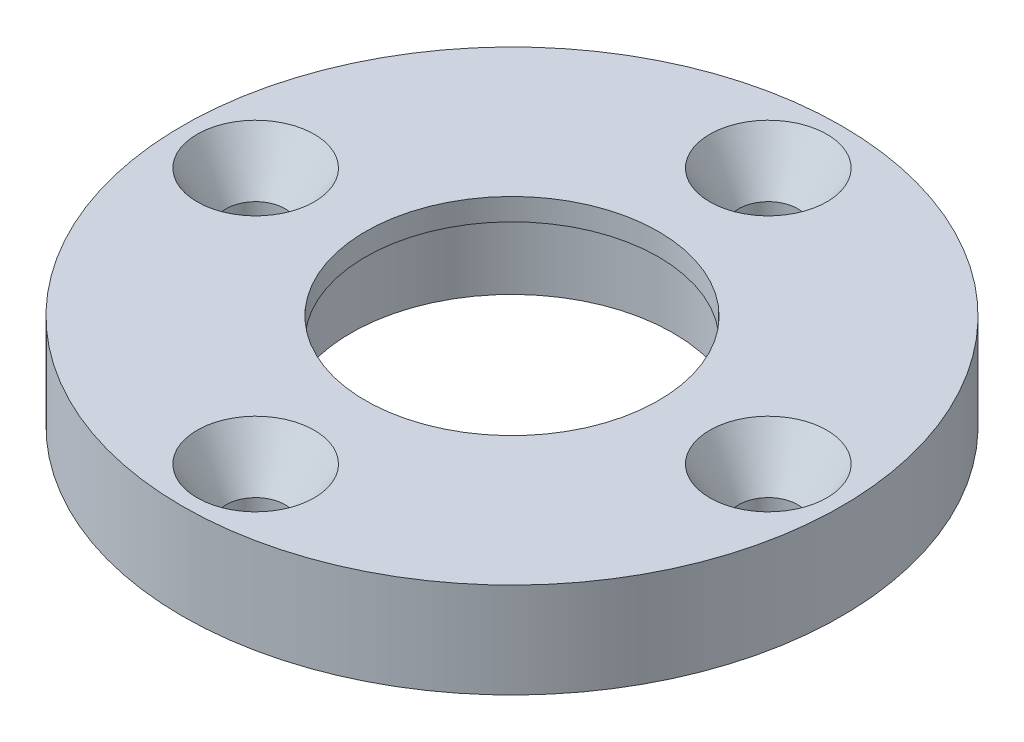
ISO-10303-21;
HEADER;
FILE_DESCRIPTION(('STEP AP214'),'2;1');
FILE_NAME('part.step','',(''),(''),'','','');
FILE_SCHEMA(('AUTOMOTIVE_DESIGN { 1 0 10303 214 1 1 1 1 }'));
ENDSEC;
DATA;
#1=APPLICATION_CONTEXT('core data for automotive mechanical design processes');
#2=APPLICATION_PROTOCOL_DEFINITION('international standard','automotive_design',2000,#1);
#3=PRODUCT_CONTEXT('',#1,'mechanical');
#4=PRODUCT('Part','Part','',(#3));
#5=PRODUCT_RELATED_PRODUCT_CATEGORY('part','',(#4));
#6=PRODUCT_DEFINITION_FORMATION('','',#4);
#7=PRODUCT_DEFINITION_CONTEXT('part definition',#1,'design');
#8=PRODUCT_DEFINITION('design','',#6,#7);
#9=PRODUCT_DEFINITION_SHAPE('','',#8);
#10=(LENGTH_UNIT() NAMED_UNIT(*) SI_UNIT(.MILLI.,.METRE.));
#11=(NAMED_UNIT(*) PLANE_ANGLE_UNIT() SI_UNIT($,.RADIAN.));
#12=(NAMED_UNIT(*) SI_UNIT($,.STERADIAN.) SOLID_ANGLE_UNIT());
#13=UNCERTAINTY_MEASURE_WITH_UNIT(LENGTH_MEASURE(1.E-05),#10,'distance_accuracy_value','');
#14=(GEOMETRIC_REPRESENTATION_CONTEXT(3) GLOBAL_UNCERTAINTY_ASSIGNED_CONTEXT((#13)) GLOBAL_UNIT_ASSIGNED_CONTEXT((#10,
#11,#12)) REPRESENTATION_CONTEXT('',''));
#15=CARTESIAN_POINT('',(0.,0.,0.));
#16=DIRECTION('',(0.,0.,1.));
#17=DIRECTION('',(1.,0.,0.));
#18=AXIS2_PLACEMENT_3D('',#15,#16,#17);
#19=CARTESIAN_POINT('',(0.,6.5,0.));
#20=DIRECTION('',(0.,-1.,0.));
#21=DIRECTION('',(0.,0.,-1.));
#22=AXIS2_PLACEMENT_3D('',#19,#20,#21);
#23=CYLINDRICAL_SURFACE('',#22,10.);
#24=CARTESIAN_POINT('',(0.,6.5,0.));
#25=DIRECTION('',(0.,1.,0.));
#26=DIRECTION('',(0.,0.,1.));
#27=AXIS2_PLACEMENT_3D('',#24,#25,#26);
#28=CIRCLE('',#27,10.);
#29=CARTESIAN_POINT('',(0.,6.5,-10.));
#30=VERTEX_POINT('',#29);
#31=EDGE_CURVE('E78',#30,#30,#28,.T.);
#32=CARTESIAN_POINT('',(0.,5.,0.));
#33=DIRECTION('',(0.,-1.,0.));
#34=DIRECTION('',(0.,0.,-1.));
#35=AXIS2_PLACEMENT_3D('',#32,#33,#34);
#36=CIRCLE('',#35,10.);
#37=CARTESIAN_POINT('',(0.,5.,-10.));
#38=VERTEX_POINT('',#37);
#39=EDGE_CURVE('E70',#38,#38,#36,.T.);
#40=CARTESIAN_POINT('',(0.,6.5,-10.));
#41=CARTESIAN_POINT('',(0.,6.484375,-10.));
#42=CARTESIAN_POINT('',(0.,6.46875,-10.));
#43=CARTESIAN_POINT('',(0.,6.4375,-10.));
#44=CARTESIAN_POINT('',(0.,6.421875,-10.));
#45=CARTESIAN_POINT('',(0.,6.390625,-10.));
#46=CARTESIAN_POINT('',(0.,6.375,-10.));
#47=CARTESIAN_POINT('',(0.,6.34375,-10.));
#48=CARTESIAN_POINT('',(0.,6.328125,-10.));
#49=CARTESIAN_POINT('',(0.,6.296875,-10.));
#50=CARTESIAN_POINT('',(0.,6.28125,-10.));
#51=CARTESIAN_POINT('',(0.,6.25,-10.));
#52=CARTESIAN_POINT('',(0.,6.234375,-10.));
#53=CARTESIAN_POINT('',(0.,6.203125,-10.));
#54=CARTESIAN_POINT('',(0.,6.1875,-10.));
#55=CARTESIAN_POINT('',(0.,6.15625,-10.));
#56=CARTESIAN_POINT('',(0.,6.140625,-10.));
#57=CARTESIAN_POINT('',(0.,6.109375,-10.));
#58=CARTESIAN_POINT('',(0.,6.09375,-10.));
#59=CARTESIAN_POINT('',(0.,6.0625,-10.));
#60=CARTESIAN_POINT('',(0.,6.046875,-10.));
#61=CARTESIAN_POINT('',(0.,6.015625,-10.));
#62=CARTESIAN_POINT('',(0.,6.,-10.));
#63=CARTESIAN_POINT('',(0.,5.96875,-10.));
#64=CARTESIAN_POINT('',(0.,5.953125,-10.));
#65=CARTESIAN_POINT('',(0.,5.921875,-10.));
#66=CARTESIAN_POINT('',(0.,5.90625,-10.));
#67=CARTESIAN_POINT('',(0.,5.875,-10.));
#68=CARTESIAN_POINT('',(0.,5.859375,-10.));
#69=CARTESIAN_POINT('',(0.,5.828125,-10.));
#70=CARTESIAN_POINT('',(0.,5.8125,-10.));
#71=CARTESIAN_POINT('',(0.,5.78125,-10.));
#72=CARTESIAN_POINT('',(0.,5.765625,-10.));
#73=CARTESIAN_POINT('',(0.,5.734375,-10.));
#74=CARTESIAN_POINT('',(0.,5.71875,-10.));
#75=CARTESIAN_POINT('',(0.,5.6875,-10.));
#76=CARTESIAN_POINT('',(0.,5.671875,-10.));
#77=CARTESIAN_POINT('',(0.,5.640625,-10.));
#78=CARTESIAN_POINT('',(0.,5.625,-10.));
#79=CARTESIAN_POINT('',(0.,5.59375,-10.));
#80=CARTESIAN_POINT('',(0.,5.578125,-10.));
#81=CARTESIAN_POINT('',(0.,5.546875,-10.));
#82=CARTESIAN_POINT('',(0.,5.53125,-10.));
#83=CARTESIAN_POINT('',(0.,5.5,-10.));
#84=CARTESIAN_POINT('',(0.,5.484375,-10.));
#85=CARTESIAN_POINT('',(0.,5.453125,-10.));
#86=CARTESIAN_POINT('',(0.,5.4375,-10.));
#87=CARTESIAN_POINT('',(0.,5.40625,-10.));
#88=CARTESIAN_POINT('',(0.,5.390625,-10.));
#89=CARTESIAN_POINT('',(0.,5.359375,-10.));
#90=CARTESIAN_POINT('',(0.,5.34375,-10.));
#91=CARTESIAN_POINT('',(0.,5.3125,-10.));
#92=CARTESIAN_POINT('',(0.,5.296875,-10.));
#93=CARTESIAN_POINT('',(0.,5.265625,-10.));
#94=CARTESIAN_POINT('',(0.,5.25,-10.));
#95=CARTESIAN_POINT('',(0.,5.21875,-10.));
#96=CARTESIAN_POINT('',(0.,5.203125,-10.));
#97=CARTESIAN_POINT('',(0.,5.171875,-10.));
#98=CARTESIAN_POINT('',(0.,5.15625,-10.));
#99=CARTESIAN_POINT('',(0.,5.125,-10.));
#100=CARTESIAN_POINT('',(0.,5.109375,-10.));
#101=CARTESIAN_POINT('',(0.,5.078125,-10.));
#102=CARTESIAN_POINT('',(0.,5.0625,-10.));
#103=CARTESIAN_POINT('',(0.,5.03125,-10.));
#104=CARTESIAN_POINT('',(0.,5.015625,-10.));
#105=CARTESIAN_POINT('',(0.,5.,-10.));
#106=B_SPLINE_CURVE_WITH_KNOTS('',3,(#40,#41,#42,#43,#44,#45,#46,#47,#48,#49,#50,#51,#52,#53,
#54,#55,#56,#57,#58,#59,#60,#61,#62,#63,#64,#65,#66,#67,#68,#69,#70,#71,#72,#73,#74,#75,#76,#77,
#78,#79,#80,#81,#82,#83,#84,#85,#86,#87,#88,#89,#90,#91,#92,#93,#94,#95,#96,#97,#98,#99,#100,
#101,#102,#103,#104,#105),.UNSPECIFIED.,.F.,.F.,(4,2,2,2,2,2,2,2,2,2,2,2,2,2,2,2,2,2,2,2,2,2,2,
2,2,2,2,2,2,2,2,2,4),(0.,0.046875,0.0937500000000001,0.140625,0.1875,0.234375,0.28125,0.328125,
0.375,0.421875,0.46875,0.515625,0.5625,0.609375,0.65625,0.703125,0.75,0.796875,0.84375,0.890625,
0.9375,0.984375,1.03125,1.078125,1.125,1.171875,1.21875,1.265625,1.3125,1.359375,1.40625,
1.453125,1.5),.UNSPECIFIED.);
#107=EDGE_CURVE('BSEAM37',#30,#38,#106,.T.);
#108=ORIENTED_EDGE('',*,*,#31,.T.);
#109=ORIENTED_EDGE('',*,*,#39,.T.);
#110=ORIENTED_EDGE('',*,*,#107,.T.);
#111=ORIENTED_EDGE('',*,*,#107,.F.);
#112=EDGE_LOOP('',(#108,#110,#109,#111));
#113=FACE_BOUND('',#112,.T.);
#114=ADVANCED_FACE('F37',(#113),#23,.F.);
#115=CARTESIAN_POINT('',(0.,6.5,0.));
#116=DIRECTION('',(0.,1.,0.));
#117=DIRECTION('',(0.,0.,1.));
#118=AXIS2_PLACEMENT_3D('',#115,#116,#117);
#119=PLANE('',#118);
#120=CARTESIAN_POINT('',(0.,6.5,17.5));
#121=DIRECTION('',(0.,1.,0.));
#122=DIRECTION('',(0.,0.,1.));
#123=AXIS2_PLACEMENT_3D('',#120,#121,#122);
#124=CIRCLE('',#123,4.00000000000004);
#125=CARTESIAN_POINT('',(0.,6.5,21.5));
#126=VERTEX_POINT('',#125);
#127=EDGE_CURVE('E52',#126,#126,#124,.F.);
#128=ORIENTED_EDGE('',*,*,#127,.T.);
#129=EDGE_LOOP('',(#128));
#130=FACE_BOUND('',#129,.T.);
#131=CARTESIAN_POINT('',(17.5,6.5,0.));
#132=DIRECTION('',(0.,1.,0.));
#133=DIRECTION('',(0.,0.,1.));
#134=AXIS2_PLACEMENT_3D('',#131,#132,#133);
#135=CIRCLE('',#134,4.00000000000006);
#136=CARTESIAN_POINT('',(17.5,6.5,4.00000000000012));
#137=VERTEX_POINT('',#136);
#138=EDGE_CURVE('E57',#137,#137,#135,.F.);
#139=ORIENTED_EDGE('',*,*,#138,.T.);
#140=EDGE_LOOP('',(#139));
#141=FACE_BOUND('',#140,.T.);
#142=CARTESIAN_POINT('',(0.,6.5,-17.5));
#143=DIRECTION('',(0.,1.,0.));
#144=DIRECTION('',(0.,0.,1.));
#145=AXIS2_PLACEMENT_3D('',#142,#143,#144);
#146=CIRCLE('',#145,4.00000000000002);
#147=CARTESIAN_POINT('',(0.,6.5,-13.5));
#148=VERTEX_POINT('',#147);
#149=EDGE_CURVE('E60',#148,#148,#146,.F.);
#150=ORIENTED_EDGE('',*,*,#149,.T.);
#151=EDGE_LOOP('',(#150));
#152=FACE_BOUND('',#151,.T.);
#153=CARTESIAN_POINT('',(-17.4999999999998,6.5,2.48689957516035E-13));
#154=DIRECTION('',(0.,1.,0.));
#155=DIRECTION('',(0.,0.,1.));
#156=AXIS2_PLACEMENT_3D('',#153,#154,#155);
#157=CIRCLE('',#156,4.00000000000004);
#158=CARTESIAN_POINT('',(-17.4999999999998,6.5,4.00000000000029));
#159=VERTEX_POINT('',#158);
#160=EDGE_CURVE('E63',#159,#159,#157,.F.);
#161=ORIENTED_EDGE('',*,*,#160,.T.);
#162=EDGE_LOOP('',(#161));
#163=FACE_BOUND('',#162,.T.);
#164=CARTESIAN_POINT('',(0.,6.5,0.));
#165=DIRECTION('',(0.,1.,0.));
#166=DIRECTION('',(0.,0.,1.));
#167=AXIS2_PLACEMENT_3D('',#164,#165,#166);
#168=CIRCLE('',#167,22.5);
#169=CARTESIAN_POINT('',(0.,6.5,-22.5));
#170=VERTEX_POINT('',#169);
#171=EDGE_CURVE('E69',#170,#170,#168,.T.);
#172=ORIENTED_EDGE('',*,*,#171,.T.);
#173=EDGE_LOOP('',(#172));
#174=FACE_BOUND('',#173,.T.);
#175=ORIENTED_EDGE('',*,*,#31,.F.);
#176=EDGE_LOOP('',(#175));
#177=FACE_BOUND('',#176,.T.);
#178=ADVANCED_FACE('F113',(#130,#141,#152,#163,#174,#177),#119,.T.);
#179=CARTESIAN_POINT('',(0.,0.,0.));
#180=DIRECTION('',(0.,1.,0.));
#181=DIRECTION('',(0.,0.,1.));
#182=AXIS2_PLACEMENT_3D('',#179,#180,#181);
#183=PLANE('',#182);
#184=CARTESIAN_POINT('',(0.,0.,0.));
#185=DIRECTION('',(0.,-1.,0.));
#186=DIRECTION('',(0.,0.,-1.));
#187=AXIS2_PLACEMENT_3D('',#184,#185,#186);
#188=CIRCLE('',#187,11.);
#189=CARTESIAN_POINT('',(0.,0.,-11.));
#190=VERTEX_POINT('',#189);
#191=EDGE_CURVE('E94',#190,#190,#188,.T.);
#192=ORIENTED_EDGE('',*,*,#191,.F.);
#193=EDGE_LOOP('',(#192));
#194=FACE_BOUND('',#193,.T.);
#195=CARTESIAN_POINT('',(0.,0.,-17.5));
#196=DIRECTION('',(0.,1.,0.));
#197=DIRECTION('',(0.,0.,1.));
#198=AXIS2_PLACEMENT_3D('',#195,#196,#197);
#199=CIRCLE('',#198,2.);
#200=CARTESIAN_POINT('',(0.,0.,-15.5));
#201=VERTEX_POINT('',#200);
#202=EDGE_CURVE('E83',#201,#201,#199,.T.);
#203=ORIENTED_EDGE('',*,*,#202,.T.);
#204=EDGE_LOOP('',(#203));
#205=FACE_BOUND('',#204,.T.);
#206=CARTESIAN_POINT('',(17.5,0.,0.));
#207=DIRECTION('',(0.,1.,0.));
#208=DIRECTION('',(0.,0.,1.));
#209=AXIS2_PLACEMENT_3D('',#206,#207,#208);
#210=CIRCLE('',#209,2.);
#211=CARTESIAN_POINT('',(17.5,0.,2.00000000000006));
#212=VERTEX_POINT('',#211);
#213=EDGE_CURVE('E89',#212,#212,#210,.T.);
#214=ORIENTED_EDGE('',*,*,#213,.T.);
#215=EDGE_LOOP('',(#214));
#216=FACE_BOUND('',#215,.T.);
#217=CARTESIAN_POINT('',(0.,0.,17.5));
#218=DIRECTION('',(0.,1.,0.));
#219=DIRECTION('',(0.,0.,1.));
#220=AXIS2_PLACEMENT_3D('',#217,#218,#219);
#221=CIRCLE('',#220,2.);
#222=CARTESIAN_POINT('',(0.,0.,19.5));
#223=VERTEX_POINT('',#222);
#224=EDGE_CURVE('E86',#223,#223,#221,.T.);
#225=ORIENTED_EDGE('',*,*,#224,.T.);
#226=EDGE_LOOP('',(#225));
#227=FACE_BOUND('',#226,.T.);
#228=CARTESIAN_POINT('',(-17.4999999999998,0.,2.48689957516035E-13));
#229=DIRECTION('',(0.,1.,0.));
#230=DIRECTION('',(0.,0.,1.));
#231=AXIS2_PLACEMENT_3D('',#228,#229,#230);
#232=CIRCLE('',#231,2.);
#233=CARTESIAN_POINT('',(-17.4999999999998,0.,2.00000000000025));
#234=VERTEX_POINT('',#233);
#235=EDGE_CURVE('E73',#234,#234,#232,.T.);
#236=ORIENTED_EDGE('',*,*,#235,.T.);
#237=EDGE_LOOP('',(#236));
#238=FACE_BOUND('',#237,.T.);
#239=CARTESIAN_POINT('',(0.,0.,0.));
#240=DIRECTION('',(0.,1.,0.));
#241=DIRECTION('',(0.,0.,1.));
#242=AXIS2_PLACEMENT_3D('',#239,#240,#241);
#243=CIRCLE('',#242,22.5);
#244=CARTESIAN_POINT('',(0.,0.,-22.5));
#245=VERTEX_POINT('',#244);
#246=EDGE_CURVE('E75',#245,#245,#243,.T.);
#247=ORIENTED_EDGE('',*,*,#246,.F.);
#248=EDGE_LOOP('',(#247));
#249=FACE_BOUND('',#248,.T.);
#250=ADVANCED_FACE('F109',(#194,#205,#216,#227,#238,#249),#183,.F.);
#251=CARTESIAN_POINT('',(0.,6.5,0.));
#252=DIRECTION('',(0.,-1.,0.));
#253=DIRECTION('',(0.,0.,-1.));
#254=AXIS2_PLACEMENT_3D('',#251,#252,#253);
#255=CYLINDRICAL_SURFACE('',#254,22.5);
#256=CARTESIAN_POINT('',(0.,6.5,-22.5));
#257=CARTESIAN_POINT('',(0.,6.43229166666667,-22.5));
#258=CARTESIAN_POINT('',(0.,6.36458333333333,-22.5));
#259=CARTESIAN_POINT('',(0.,6.22916666666667,-22.5));
#260=CARTESIAN_POINT('',(0.,6.16145833333333,-22.5));
#261=CARTESIAN_POINT('',(0.,6.02604166666667,-22.5));
#262=CARTESIAN_POINT('',(0.,5.95833333333333,-22.5));
#263=CARTESIAN_POINT('',(0.,5.82291666666667,-22.5));
#264=CARTESIAN_POINT('',(0.,5.75520833333333,-22.5));
#265=CARTESIAN_POINT('',(0.,5.61979166666667,-22.5));
#266=CARTESIAN_POINT('',(0.,5.55208333333333,-22.5));
#267=CARTESIAN_POINT('',(0.,5.41666666666667,-22.5));
#268=CARTESIAN_POINT('',(0.,5.34895833333333,-22.5));
#269=CARTESIAN_POINT('',(0.,5.21354166666667,-22.5));
#270=CARTESIAN_POINT('',(0.,5.14583333333333,-22.5));
#271=CARTESIAN_POINT('',(0.,5.01041666666667,-22.5));
#272=CARTESIAN_POINT('',(0.,4.94270833333333,-22.5));
#273=CARTESIAN_POINT('',(0.,4.80729166666667,-22.5));
#274=CARTESIAN_POINT('',(0.,4.73958333333333,-22.5));
#275=CARTESIAN_POINT('',(0.,4.60416666666667,-22.5));
#276=CARTESIAN_POINT('',(0.,4.53645833333333,-22.5));
#277=CARTESIAN_POINT('',(0.,4.40104166666667,-22.5));
#278=CARTESIAN_POINT('',(0.,4.33333333333333,-22.5));
#279=CARTESIAN_POINT('',(0.,4.19791666666667,-22.5));
#280=CARTESIAN_POINT('',(0.,4.13020833333333,-22.5));
#281=CARTESIAN_POINT('',(0.,3.99479166666667,-22.5));
#282=CARTESIAN_POINT('',(0.,3.92708333333333,-22.5));
#283=CARTESIAN_POINT('',(0.,3.79166666666667,-22.5));
#284=CARTESIAN_POINT('',(0.,3.72395833333333,-22.5));
#285=CARTESIAN_POINT('',(0.,3.58854166666667,-22.5));
#286=CARTESIAN_POINT('',(0.,3.52083333333333,-22.5));
#287=CARTESIAN_POINT('',(0.,3.38541666666667,-22.5));
#288=CARTESIAN_POINT('',(0.,3.31770833333333,-22.5));
#289=CARTESIAN_POINT('',(0.,3.18229166666667,-22.5));
#290=CARTESIAN_POINT('',(0.,3.11458333333333,-22.5));
#291=CARTESIAN_POINT('',(0.,2.97916666666667,-22.5));
#292=CARTESIAN_POINT('',(0.,2.91145833333333,-22.5));
#293=CARTESIAN_POINT('',(0.,2.77604166666667,-22.5));
#294=CARTESIAN_POINT('',(0.,2.70833333333333,-22.5));
#295=CARTESIAN_POINT('',(0.,2.57291666666667,-22.5));
#296=CARTESIAN_POINT('',(0.,2.50520833333333,-22.5));
#297=CARTESIAN_POINT('',(0.,2.36979166666667,-22.5));
#298=CARTESIAN_POINT('',(0.,2.30208333333333,-22.5));
#299=CARTESIAN_POINT('',(0.,2.16666666666667,-22.5));
#300=CARTESIAN_POINT('',(0.,2.09895833333333,-22.5));
#301=CARTESIAN_POINT('',(0.,1.96354166666667,-22.5));
#302=CARTESIAN_POINT('',(0.,1.89583333333333,-22.5));
#303=CARTESIAN_POINT('',(0.,1.76041666666667,-22.5));
#304=CARTESIAN_POINT('',(0.,1.69270833333333,-22.5));
#305=CARTESIAN_POINT('',(0.,1.55729166666667,-22.5));
#306=CARTESIAN_POINT('',(0.,1.48958333333333,-22.5));
#307=CARTESIAN_POINT('',(0.,1.35416666666667,-22.5));
#308=CARTESIAN_POINT('',(0.,1.28645833333333,-22.5));
#309=CARTESIAN_POINT('',(0.,1.15104166666667,-22.5));
#310=CARTESIAN_POINT('',(0.,1.08333333333333,-22.5));
#311=CARTESIAN_POINT('',(0.,0.947916666666667,-22.5));
#312=CARTESIAN_POINT('',(0.,0.880208333333333,-22.5));
#313=CARTESIAN_POINT('',(0.,0.744791666666667,-22.5));
#314=CARTESIAN_POINT('',(0.,0.677083333333333,-22.5));
#315=CARTESIAN_POINT('',(0.,0.541666666666667,-22.5));
#316=CARTESIAN_POINT('',(0.,0.473958333333333,-22.5));
#317=CARTESIAN_POINT('',(0.,0.338541666666667,-22.5));
#318=CARTESIAN_POINT('',(0.,0.270833333333334,-22.5));
#319=CARTESIAN_POINT('',(0.,0.135416666666667,-22.5));
#320=CARTESIAN_POINT('',(0.,0.0677083333333334,-22.5));
#321=CARTESIAN_POINT('',(0.,0.,-22.5));
#322=B_SPLINE_CURVE_WITH_KNOTS('',3,(#256,#257,#258,#259,#260,#261,#262,#263,#264,#265,#266,
#267,#268,#269,#270,#271,#272,#273,#274,#275,#276,#277,#278,#279,#280,#281,#282,#283,#284,#285,
#286,#287,#288,#289,#290,#291,#292,#293,#294,#295,#296,#297,#298,#299,#300,#301,#302,#303,#304,
#305,#306,#307,#308,#309,#310,#311,#312,#313,#314,#315,#316,#317,#318,#319,#320,#321),
.UNSPECIFIED.,.F.,.F.,(4,2,2,2,2,2,2,2,2,2,2,2,2,2,2,2,2,2,2,2,2,2,2,2,2,2,2,2,2,2,2,2,4),(0.,
0.203125,0.40625,0.609375000000001,0.812500000000001,1.015625,1.21875,1.421875,1.625,1.828125,
2.03125,2.234375,2.4375,2.640625,2.84375,3.046875,3.25,3.453125,3.65625,3.859375,4.0625,
4.265625,4.46875,4.671875,4.875,5.078125,5.28125,5.484375,5.6875,5.890625,6.09375,6.296875,6.5),.UNSPECIFIED.);
#323=EDGE_CURVE('BSEAM112',#170,#245,#322,.T.);
#324=ORIENTED_EDGE('',*,*,#171,.F.);
#325=ORIENTED_EDGE('',*,*,#246,.T.);
#326=ORIENTED_EDGE('',*,*,#323,.T.);
#327=ORIENTED_EDGE('',*,*,#323,.F.);
#328=EDGE_LOOP('',(#324,#326,#325,#327));
#329=FACE_BOUND('',#328,.T.);
#330=ADVANCED_FACE('F112',(#329),#255,.T.);
#331=CARTESIAN_POINT('',(-17.4999999999998,0.,2.48689957516035E-13));
#332=DIRECTION('',(0.,1.,0.));
#333=DIRECTION('',(0.,0.,1.));
#334=AXIS2_PLACEMENT_3D('',#331,#332,#333);
#335=CYLINDRICAL_SURFACE('',#334,2.);
#336=CARTESIAN_POINT('',(-17.4999999999998,3.09999999999991,2.48689957516035E-13));
#337=DIRECTION('',(0.,1.,0.));
#338=DIRECTION('',(0.,0.,1.));
#339=AXIS2_PLACEMENT_3D('',#336,#337,#338);
#340=CIRCLE('',#339,2.);
#341=CARTESIAN_POINT('',(-17.4999999999998,3.09999999999991,2.00000000000025));
#342=VERTEX_POINT('',#341);
#343=EDGE_CURVE('E10',#342,#342,#340,.T.);
#344=CARTESIAN_POINT('',(-17.4999999999998,3.09999999999991,2.00000000000025));
#345=CARTESIAN_POINT('',(-17.4999999999998,3.06770833333324,2.00000000000025));
#346=CARTESIAN_POINT('',(-17.4999999999998,3.03541666666658,2.00000000000025));
#347=CARTESIAN_POINT('',(-17.4999999999998,2.97083333333324,2.00000000000025));
#348=CARTESIAN_POINT('',(-17.4999999999998,2.93854166666658,2.00000000000025));
#349=CARTESIAN_POINT('',(-17.4999999999998,2.87395833333325,2.00000000000025));
#350=CARTESIAN_POINT('',(-17.4999999999998,2.84166666666658,2.00000000000025));
#351=CARTESIAN_POINT('',(-17.4999999999998,2.77708333333325,2.00000000000025));
#352=CARTESIAN_POINT('',(-17.4999999999998,2.74479166666658,2.00000000000025));
#353=CARTESIAN_POINT('',(-17.4999999999998,2.68020833333325,2.00000000000025));
#354=CARTESIAN_POINT('',(-17.4999999999998,2.64791666666659,2.00000000000025));
#355=CARTESIAN_POINT('',(-17.4999999999998,2.58333333333326,2.00000000000025));
#356=CARTESIAN_POINT('',(-17.4999999999998,2.55104166666659,2.00000000000025));
#357=CARTESIAN_POINT('',(-17.4999999999998,2.48645833333326,2.00000000000025));
#358=CARTESIAN_POINT('',(-17.4999999999998,2.45416666666659,2.00000000000025));
#359=CARTESIAN_POINT('',(-17.4999999999998,2.38958333333326,2.00000000000025));
#360=CARTESIAN_POINT('',(-17.4999999999998,2.3572916666666,2.00000000000025));
#361=CARTESIAN_POINT('',(-17.4999999999998,2.29270833333326,2.00000000000025));
#362=CARTESIAN_POINT('',(-17.4999999999998,2.2604166666666,2.00000000000025));
#363=CARTESIAN_POINT('',(-17.4999999999998,2.19583333333327,2.00000000000025));
#364=CARTESIAN_POINT('',(-17.4999999999998,2.1635416666666,2.00000000000025));
#365=CARTESIAN_POINT('',(-17.4999999999998,2.09895833333327,2.00000000000025));
#366=CARTESIAN_POINT('',(-17.4999999999998,2.0666666666666,2.00000000000025));
#367=CARTESIAN_POINT('',(-17.4999999999998,2.00208333333327,2.00000000000025));
#368=CARTESIAN_POINT('',(-17.4999999999998,1.96979166666661,2.00000000000025));
#369=CARTESIAN_POINT('',(-17.4999999999998,1.90520833333328,2.00000000000025));
#370=CARTESIAN_POINT('',(-17.4999999999998,1.87291666666661,2.00000000000025));
#371=CARTESIAN_POINT('',(-17.4999999999998,1.80833333333328,2.00000000000025));
#372=CARTESIAN_POINT('',(-17.4999999999998,1.77604166666661,2.00000000000025));
#373=CARTESIAN_POINT('',(-17.4999999999998,1.71145833333328,2.00000000000025));
#374=CARTESIAN_POINT('',(-17.4999999999998,1.67916666666662,2.00000000000025));
#375=CARTESIAN_POINT('',(-17.4999999999998,1.61458333333329,2.00000000000025));
#376=CARTESIAN_POINT('',(-17.4999999999998,1.58229166666662,2.00000000000025));
#377=CARTESIAN_POINT('',(-17.4999999999998,1.51770833333329,2.00000000000025));
#378=CARTESIAN_POINT('',(-17.4999999999998,1.48541666666662,2.00000000000025));
#379=CARTESIAN_POINT('',(-17.4999999999998,1.42083333333329,2.00000000000025));
#380=CARTESIAN_POINT('',(-17.4999999999998,1.38854166666663,2.00000000000025));
#381=CARTESIAN_POINT('',(-17.4999999999998,1.32395833333329,2.00000000000025));
#382=CARTESIAN_POINT('',(-17.4999999999998,1.29166666666663,2.00000000000025));
#383=CARTESIAN_POINT('',(-17.4999999999998,1.2270833333333,2.00000000000025));
#384=CARTESIAN_POINT('',(-17.4999999999998,1.19479166666663,2.00000000000025));
#385=CARTESIAN_POINT('',(-17.4999999999998,1.1302083333333,2.00000000000025));
#386=CARTESIAN_POINT('',(-17.4999999999998,1.09791666666663,2.00000000000025));
#387=CARTESIAN_POINT('',(-17.4999999999998,1.0333333333333,2.00000000000025));
#388=CARTESIAN_POINT('',(-17.4999999999998,1.00104166666664,2.00000000000025));
#389=CARTESIAN_POINT('',(-17.4999999999998,0.936458333333305,2.00000000000025));
#390=CARTESIAN_POINT('',(-17.4999999999998,0.904166666666639,2.00000000000025));
#391=CARTESIAN_POINT('',(-17.4999999999998,0.839583333333308,2.00000000000025));
#392=CARTESIAN_POINT('',(-17.4999999999998,0.807291666666643,2.00000000000025));
#393=CARTESIAN_POINT('',(-17.4999999999998,0.742708333333311,2.00000000000025));
#394=CARTESIAN_POINT('',(-17.4999999999998,0.710416666666646,2.00000000000025));
#395=CARTESIAN_POINT('',(-17.4999999999998,0.645833333333314,2.00000000000025));
#396=CARTESIAN_POINT('',(-17.4999999999998,0.613541666666648,2.00000000000025));
#397=CARTESIAN_POINT('',(-17.4999999999998,0.548958333333317,2.00000000000025));
#398=CARTESIAN_POINT('',(-17.4999999999998,0.516666666666651,2.00000000000025));
#399=CARTESIAN_POINT('',(-17.4999999999998,0.45208333333332,2.00000000000025));
#400=CARTESIAN_POINT('',(-17.4999999999998,0.419791666666654,2.00000000000025));
#401=CARTESIAN_POINT('',(-17.4999999999998,0.355208333333323,2.00000000000025));
#402=CARTESIAN_POINT('',(-17.4999999999998,0.322916666666657,2.00000000000025));
#403=CARTESIAN_POINT('',(-17.4999999999998,0.258333333333326,2.00000000000025));
#404=CARTESIAN_POINT('',(-17.4999999999998,0.22604166666666,2.00000000000025));
#405=CARTESIAN_POINT('',(-17.4999999999998,0.161458333333329,2.00000000000025));
#406=CARTESIAN_POINT('',(-17.4999999999998,0.129166666666663,2.00000000000025));
#407=CARTESIAN_POINT('',(-17.4999999999998,0.0645833333333314,2.00000000000025));
#408=CARTESIAN_POINT('',(-17.4999999999998,0.0322916666666657,2.00000000000025));
#409=CARTESIAN_POINT('',(-17.4999999999998,0.,2.00000000000025));
#410=B_SPLINE_CURVE_WITH_KNOTS('',3,(#344,#345,#346,#347,#348,#349,#350,#351,#352,#353,#354,
#355,#356,#357,#358,#359,#360,#361,#362,#363,#364,#365,#366,#367,#368,#369,#370,#371,#372,#373,
#374,#375,#376,#377,#378,#379,#380,#381,#382,#383,#384,#385,#386,#387,#388,#389,#390,#391,#392,
#393,#394,#395,#396,#397,#398,#399,#400,#401,#402,#403,#404,#405,#406,#407,#408,#409),
.UNSPECIFIED.,.F.,.F.,(4,2,2,2,2,2,2,2,2,2,2,2,2,2,2,2,2,2,2,2,2,2,2,2,2,2,2,2,2,2,2,2,4),(0.,
0.0968749999999971,0.193749999999994,0.290624999999991,0.387499999999989,0.484374999999986,
0.581249999999983,0.67812499999998,0.774999999999977,0.871874999999974,0.968749999999971,
1.06562499999997,1.16249999999997,1.25937499999996,1.35624999999996,1.45312499999996,
1.54999999999995,1.64687499999995,1.74374999999995,1.84062499999994,1.93749999999994,
2.03437499999994,2.13124999999994,2.22812499999993,2.32499999999993,2.42187499999993,
2.51874999999992,2.61562499999992,2.71249999999992,2.80937499999992,2.90624999999991,
3.00312499999991,3.09999999999991),.UNSPECIFIED.);
#411=EDGE_CURVE('BSEAM126',#342,#234,#410,.T.);
#412=ORIENTED_EDGE('',*,*,#343,.T.);
#413=ORIENTED_EDGE('',*,*,#235,.F.);
#414=ORIENTED_EDGE('',*,*,#411,.T.);
#415=ORIENTED_EDGE('',*,*,#411,.F.);
#416=EDGE_LOOP('',(#412,#414,#413,#415));
#417=FACE_BOUND('',#416,.T.);
#418=ADVANCED_FACE('F126',(#417),#335,.F.);
#419=CARTESIAN_POINT('',(0.,0.,17.5));
#420=DIRECTION('',(0.,1.,0.));
#421=DIRECTION('',(0.,0.,1.));
#422=AXIS2_PLACEMENT_3D('',#419,#420,#421);
#423=CYLINDRICAL_SURFACE('',#422,2.);
#424=CARTESIAN_POINT('',(0.,3.0999999999999,17.5));
#425=DIRECTION('',(0.,1.,0.));
#426=DIRECTION('',(0.,0.,1.));
#427=AXIS2_PLACEMENT_3D('',#424,#425,#426);
#428=CIRCLE('',#427,2.);
#429=CARTESIAN_POINT('',(0.,3.0999999999999,19.5));
#430=VERTEX_POINT('',#429);
#431=EDGE_CURVE('E66',#430,#430,#428,.T.);
#432=CARTESIAN_POINT('',(0.,3.0999999999999,19.5));
#433=CARTESIAN_POINT('',(0.,3.06770833333324,19.5));
#434=CARTESIAN_POINT('',(0.,3.03541666666657,19.5));
#435=CARTESIAN_POINT('',(0.,2.97083333333324,19.5));
#436=CARTESIAN_POINT('',(0.,2.93854166666657,19.5));
#437=CARTESIAN_POINT('',(0.,2.87395833333324,19.5));
#438=CARTESIAN_POINT('',(0.,2.84166666666658,19.5));
#439=CARTESIAN_POINT('',(0.,2.77708333333325,19.5));
#440=CARTESIAN_POINT('',(0.,2.74479166666658,19.5));
#441=CARTESIAN_POINT('',(0.,2.68020833333325,19.5));
#442=CARTESIAN_POINT('',(0.,2.64791666666658,19.5));
#443=CARTESIAN_POINT('',(0.,2.58333333333325,19.5));
#444=CARTESIAN_POINT('',(0.,2.55104166666659,19.5));
#445=CARTESIAN_POINT('',(0.,2.48645833333325,19.5));
#446=CARTESIAN_POINT('',(0.,2.45416666666659,19.5));
#447=CARTESIAN_POINT('',(0.,2.38958333333326,19.5));
#448=CARTESIAN_POINT('',(0.,2.35729166666659,19.5));
#449=CARTESIAN_POINT('',(0.,2.29270833333326,19.5));
#450=CARTESIAN_POINT('',(0.,2.2604166666666,19.5));
#451=CARTESIAN_POINT('',(0.,2.19583333333326,19.5));
#452=CARTESIAN_POINT('',(0.,2.1635416666666,19.5));
#453=CARTESIAN_POINT('',(0.,2.09895833333327,19.5));
#454=CARTESIAN_POINT('',(0.,2.0666666666666,19.5));
#455=CARTESIAN_POINT('',(0.,2.00208333333327,19.5));
#456=CARTESIAN_POINT('',(0.,1.9697916666666,19.5));
#457=CARTESIAN_POINT('',(0.,1.90520833333327,19.5));
#458=CARTESIAN_POINT('',(0.,1.87291666666661,19.5));
#459=CARTESIAN_POINT('',(0.,1.80833333333328,19.5));
#460=CARTESIAN_POINT('',(0.,1.77604166666661,19.5));
#461=CARTESIAN_POINT('',(0.,1.71145833333328,19.5));
#462=CARTESIAN_POINT('',(0.,1.67916666666661,19.5));
#463=CARTESIAN_POINT('',(0.,1.61458333333328,19.5));
#464=CARTESIAN_POINT('',(0.,1.58229166666662,19.5));
#465=CARTESIAN_POINT('',(0.,1.51770833333329,19.5));
#466=CARTESIAN_POINT('',(0.,1.48541666666662,19.5));
#467=CARTESIAN_POINT('',(0.,1.42083333333329,19.5));
#468=CARTESIAN_POINT('',(0.,1.38854166666662,19.5));
#469=CARTESIAN_POINT('',(0.,1.32395833333329,19.5));
#470=CARTESIAN_POINT('',(0.,1.29166666666663,19.5));
#471=CARTESIAN_POINT('',(0.,1.22708333333329,19.5));
#472=CARTESIAN_POINT('',(0.,1.19479166666663,19.5));
#473=CARTESIAN_POINT('',(0.,1.1302083333333,19.5));
#474=CARTESIAN_POINT('',(0.,1.09791666666663,19.5));
#475=CARTESIAN_POINT('',(0.,1.0333333333333,19.5));
#476=CARTESIAN_POINT('',(0.,1.00104166666664,19.5));
#477=CARTESIAN_POINT('',(0.,0.936458333333304,19.5));
#478=CARTESIAN_POINT('',(0.,0.904166666666638,19.5));
#479=CARTESIAN_POINT('',(0.,0.839583333333307,19.5));
#480=CARTESIAN_POINT('',(0.,0.807291666666641,19.5));
#481=CARTESIAN_POINT('',(0.,0.74270833333331,19.5));
#482=CARTESIAN_POINT('',(0.,0.710416666666644,19.5));
#483=CARTESIAN_POINT('',(0.,0.645833333333313,19.5));
#484=CARTESIAN_POINT('',(0.,0.613541666666647,19.5));
#485=CARTESIAN_POINT('',(0.,0.548958333333316,19.5));
#486=CARTESIAN_POINT('',(0.,0.51666666666665,19.5));
#487=CARTESIAN_POINT('',(0.,0.452083333333319,19.5));
#488=CARTESIAN_POINT('',(0.,0.419791666666653,19.5));
#489=CARTESIAN_POINT('',(0.,0.355208333333322,19.5));
#490=CARTESIAN_POINT('',(0.,0.322916666666656,19.5));
#491=CARTESIAN_POINT('',(0.,0.258333333333325,19.5));
#492=CARTESIAN_POINT('',(0.,0.22604166666666,19.5));
#493=CARTESIAN_POINT('',(0.,0.161458333333328,19.5));
#494=CARTESIAN_POINT('',(0.,0.129166666666663,19.5));
#495=CARTESIAN_POINT('',(0.,0.0645833333333314,19.5));
#496=CARTESIAN_POINT('',(0.,0.0322916666666657,19.5));
#497=CARTESIAN_POINT('',(0.,0.,19.5));
#498=B_SPLINE_CURVE_WITH_KNOTS('',3,(#432,#433,#434,#435,#436,#437,#438,#439,#440,#441,#442,
#443,#444,#445,#446,#447,#448,#449,#450,#451,#452,#453,#454,#455,#456,#457,#458,#459,#460,#461,
#462,#463,#464,#465,#466,#467,#468,#469,#470,#471,#472,#473,#474,#475,#476,#477,#478,#479,#480,
#481,#482,#483,#484,#485,#486,#487,#488,#489,#490,#491,#492,#493,#494,#495,#496,#497),
.UNSPECIFIED.,.F.,.F.,(4,2,2,2,2,2,2,2,2,2,2,2,2,2,2,2,2,2,2,2,2,2,2,2,2,2,2,2,2,2,2,2,4),(0.,
0.0968749999999971,0.193749999999994,0.290624999999991,0.387499999999988,0.484374999999985,
0.581249999999982,0.678124999999979,0.774999999999975,0.871874999999973,0.96874999999997,
1.06562499999997,1.16249999999996,1.25937499999996,1.35624999999996,1.45312499999995,
1.54999999999995,1.64687499999995,1.74374999999994,1.84062499999994,1.93749999999994,
2.03437499999994,2.13124999999993,2.22812499999993,2.32499999999993,2.42187499999992,
2.51874999999992,2.61562499999992,2.71249999999991,2.80937499999991,2.90624999999991,
3.0031249999999,3.0999999999999),.UNSPECIFIED.);
#499=EDGE_CURVE('BSEAM133',#430,#223,#498,.T.);
#500=ORIENTED_EDGE('',*,*,#431,.T.);
#501=ORIENTED_EDGE('',*,*,#224,.F.);
#502=ORIENTED_EDGE('',*,*,#499,.T.);
#503=ORIENTED_EDGE('',*,*,#499,.F.);
#504=EDGE_LOOP('',(#500,#502,#501,#503));
#505=FACE_BOUND('',#504,.T.);
#506=ADVANCED_FACE('F133',(#505),#423,.F.);
#507=CARTESIAN_POINT('',(17.5,0.,0.));
#508=DIRECTION('',(0.,1.,0.));
#509=DIRECTION('',(0.,0.,1.));
#510=AXIS2_PLACEMENT_3D('',#507,#508,#509);
#511=CYLINDRICAL_SURFACE('',#510,2.);
#512=CARTESIAN_POINT('',(17.5,3.09999999999987,0.));
#513=DIRECTION('',(0.,1.,0.));
#514=DIRECTION('',(0.,0.,1.));
#515=AXIS2_PLACEMENT_3D('',#512,#513,#514);
#516=CIRCLE('',#515,2.);
#517=CARTESIAN_POINT('',(17.5,3.09999999999987,2.00000000000006));
#518=VERTEX_POINT('',#517);
#519=EDGE_CURVE('E48',#518,#518,#516,.T.);
#520=CARTESIAN_POINT('',(17.5,3.09999999999987,2.00000000000006));
#521=CARTESIAN_POINT('',(17.5,3.06770833333321,2.00000000000006));
#522=CARTESIAN_POINT('',(17.5,3.03541666666654,2.00000000000006));
#523=CARTESIAN_POINT('',(17.5,2.97083333333321,2.00000000000006));
#524=CARTESIAN_POINT('',(17.5,2.93854166666655,2.00000000000006));
#525=CARTESIAN_POINT('',(17.5,2.87395833333321,2.00000000000006));
#526=CARTESIAN_POINT('',(17.5,2.84166666666655,2.00000000000006));
#527=CARTESIAN_POINT('',(17.5,2.77708333333322,2.00000000000006));
#528=CARTESIAN_POINT('',(17.5,2.74479166666655,2.00000000000006));
#529=CARTESIAN_POINT('',(17.5,2.68020833333322,2.00000000000006));
#530=CARTESIAN_POINT('',(17.5,2.64791666666656,2.00000000000006));
#531=CARTESIAN_POINT('',(17.5,2.58333333333323,2.00000000000006));
#532=CARTESIAN_POINT('',(17.5,2.55104166666656,2.00000000000006));
#533=CARTESIAN_POINT('',(17.5,2.48645833333323,2.00000000000006));
#534=CARTESIAN_POINT('',(17.5,2.45416666666657,2.00000000000006));
#535=CARTESIAN_POINT('',(17.5,2.38958333333323,2.00000000000006));
#536=CARTESIAN_POINT('',(17.5,2.35729166666657,2.00000000000006));
#537=CARTESIAN_POINT('',(17.5,2.29270833333324,2.00000000000006));
#538=CARTESIAN_POINT('',(17.5,2.26041666666657,2.00000000000006));
#539=CARTESIAN_POINT('',(17.5,2.19583333333324,2.00000000000006));
#540=CARTESIAN_POINT('',(17.5,2.16354166666658,2.00000000000006));
#541=CARTESIAN_POINT('',(17.5,2.09895833333325,2.00000000000006));
#542=CARTESIAN_POINT('',(17.5,2.06666666666658,2.00000000000006));
#543=CARTESIAN_POINT('',(17.5,2.00208333333325,2.00000000000006));
#544=CARTESIAN_POINT('',(17.5,1.96979166666659,2.00000000000006));
#545=CARTESIAN_POINT('',(17.5,1.90520833333326,2.00000000000006));
#546=CARTESIAN_POINT('',(17.5,1.87291666666659,2.00000000000006));
#547=CARTESIAN_POINT('',(17.5,1.80833333333326,2.00000000000006));
#548=CARTESIAN_POINT('',(17.5,1.77604166666659,2.00000000000006));
#549=CARTESIAN_POINT('',(17.5,1.71145833333326,2.00000000000006));
#550=CARTESIAN_POINT('',(17.5,1.6791666666666,2.00000000000006));
#551=CARTESIAN_POINT('',(17.5,1.61458333333327,2.00000000000006));
#552=CARTESIAN_POINT('',(17.5,1.5822916666666,2.00000000000006));
#553=CARTESIAN_POINT('',(17.5,1.51770833333327,2.00000000000006));
#554=CARTESIAN_POINT('',(17.5,1.48541666666661,2.00000000000006));
#555=CARTESIAN_POINT('',(17.5,1.42083333333327,2.00000000000006));
#556=CARTESIAN_POINT('',(17.5,1.38854166666661,2.00000000000006));
#557=CARTESIAN_POINT('',(17.5,1.32395833333328,2.00000000000006));
#558=CARTESIAN_POINT('',(17.5,1.29166666666661,2.00000000000006));
#559=CARTESIAN_POINT('',(17.5,1.22708333333328,2.00000000000006));
#560=CARTESIAN_POINT('',(17.5,1.19479166666662,2.00000000000006));
#561=CARTESIAN_POINT('',(17.5,1.13020833333329,2.00000000000006));
#562=CARTESIAN_POINT('',(17.5,1.09791666666662,2.00000000000006));
#563=CARTESIAN_POINT('',(17.5,1.03333333333329,2.00000000000006));
#564=CARTESIAN_POINT('',(17.5,1.00104166666663,2.00000000000006));
#565=CARTESIAN_POINT('',(17.5,0.936458333333295,2.00000000000006));
#566=CARTESIAN_POINT('',(17.5,0.904166666666629,2.00000000000006));
#567=CARTESIAN_POINT('',(17.5,0.839583333333299,2.00000000000006));
#568=CARTESIAN_POINT('',(17.5,0.807291666666634,2.00000000000006));
#569=CARTESIAN_POINT('',(17.5,0.742708333333303,2.00000000000006));
#570=CARTESIAN_POINT('',(17.5,0.710416666666637,2.00000000000006));
#571=CARTESIAN_POINT('',(17.5,0.645833333333307,2.00000000000006));
#572=CARTESIAN_POINT('',(17.5,0.613541666666641,2.00000000000006));
#573=CARTESIAN_POINT('',(17.5,0.548958333333311,2.00000000000006));
#574=CARTESIAN_POINT('',(17.5,0.516666666666645,2.00000000000006));
#575=CARTESIAN_POINT('',(17.5,0.452083333333315,2.00000000000006));
#576=CARTESIAN_POINT('',(17.5,0.419791666666649,2.00000000000006));
#577=CARTESIAN_POINT('',(17.5,0.355208333333319,2.00000000000006));
#578=CARTESIAN_POINT('',(17.5,0.322916666666653,2.00000000000006));
#579=CARTESIAN_POINT('',(17.5,0.258333333333323,2.00000000000006));
#580=CARTESIAN_POINT('',(17.5,0.226041666666657,2.00000000000006));
#581=CARTESIAN_POINT('',(17.5,0.161458333333327,2.00000000000006));
#582=CARTESIAN_POINT('',(17.5,0.129166666666661,2.00000000000006));
#583=CARTESIAN_POINT('',(17.5,0.0645833333333306,2.00000000000006));
#584=CARTESIAN_POINT('',(17.5,0.0322916666666653,2.00000000000006));
#585=CARTESIAN_POINT('',(17.5,0.,2.00000000000006));
#586=B_SPLINE_CURVE_WITH_KNOTS('',3,(#520,#521,#522,#523,#524,#525,#526,#527,#528,#529,#530,
#531,#532,#533,#534,#535,#536,#537,#538,#539,#540,#541,#542,#543,#544,#545,#546,#547,#548,#549,
#550,#551,#552,#553,#554,#555,#556,#557,#558,#559,#560,#561,#562,#563,#564,#565,#566,#567,#568,
#569,#570,#571,#572,#573,#574,#575,#576,#577,#578,#579,#580,#581,#582,#583,#584,#585),
.UNSPECIFIED.,.F.,.F.,(4,2,2,2,2,2,2,2,2,2,2,2,2,2,2,2,2,2,2,2,2,2,2,2,2,2,2,2,2,2,2,2,4),(0.,
0.0968749999999958,0.193749999999992,0.290624999999988,0.387499999999984,0.48437499999998,
0.581249999999976,0.678124999999972,0.774999999999968,0.871874999999964,0.96874999999996,
1.06562499999996,1.16249999999995,1.25937499999995,1.35624999999994,1.45312499999994,
1.54999999999994,1.64687499999993,1.74374999999993,1.84062499999992,1.93749999999992,
2.03437499999992,2.13124999999991,2.22812499999991,2.3249999999999,2.4218749999999,
2.5187499999999,2.61562499999989,2.71249999999989,2.80937499999988,2.90624999999988,
3.00312499999988,3.09999999999987),.UNSPECIFIED.);
#587=EDGE_CURVE('BSEAM148',#518,#212,#586,.T.);
#588=ORIENTED_EDGE('',*,*,#519,.T.);
#589=ORIENTED_EDGE('',*,*,#213,.F.);
#590=ORIENTED_EDGE('',*,*,#587,.T.);
#591=ORIENTED_EDGE('',*,*,#587,.F.);
#592=EDGE_LOOP('',(#588,#590,#589,#591));
#593=FACE_BOUND('',#592,.T.);
#594=ADVANCED_FACE('F148',(#593),#511,.F.);
#595=CARTESIAN_POINT('',(0.,0.,-17.5));
#596=DIRECTION('',(0.,1.,0.));
#597=DIRECTION('',(0.,0.,1.));
#598=AXIS2_PLACEMENT_3D('',#595,#596,#597);
#599=CYLINDRICAL_SURFACE('',#598,2.);
#600=CARTESIAN_POINT('',(0.,3.09999999999996,-17.5));
#601=DIRECTION('',(0.,1.,0.));
#602=DIRECTION('',(0.,0.,1.));
#603=AXIS2_PLACEMENT_3D('',#600,#601,#602);
#604=CIRCLE('',#603,2.);
#605=CARTESIAN_POINT('',(0.,3.09999999999996,-15.5));
#606=VERTEX_POINT('',#605);
#607=EDGE_CURVE('E44',#606,#606,#604,.T.);
#608=CARTESIAN_POINT('',(0.,3.09999999999996,-15.5));
#609=CARTESIAN_POINT('',(0.,3.06770833333329,-15.5));
#610=CARTESIAN_POINT('',(0.,3.03541666666663,-15.5));
#611=CARTESIAN_POINT('',(0.,2.97083333333329,-15.5));
#612=CARTESIAN_POINT('',(0.,2.93854166666663,-15.5));
#613=CARTESIAN_POINT('',(0.,2.87395833333329,-15.5));
#614=CARTESIAN_POINT('',(0.,2.84166666666663,-15.5));
#615=CARTESIAN_POINT('',(0.,2.7770833333333,-15.5));
#616=CARTESIAN_POINT('',(0.,2.74479166666663,-15.5));
#617=CARTESIAN_POINT('',(0.,2.6802083333333,-15.5));
#618=CARTESIAN_POINT('',(0.,2.64791666666663,-15.5));
#619=CARTESIAN_POINT('',(0.,2.5833333333333,-15.5));
#620=CARTESIAN_POINT('',(0.,2.55104166666663,-15.5));
#621=CARTESIAN_POINT('',(0.,2.4864583333333,-15.5));
#622=CARTESIAN_POINT('',(0.,2.45416666666663,-15.5));
#623=CARTESIAN_POINT('',(0.,2.3895833333333,-15.5));
#624=CARTESIAN_POINT('',(0.,2.35729166666663,-15.5));
#625=CARTESIAN_POINT('',(0.,2.2927083333333,-15.5));
#626=CARTESIAN_POINT('',(0.,2.26041666666664,-15.5));
#627=CARTESIAN_POINT('',(0.,2.1958333333333,-15.5));
#628=CARTESIAN_POINT('',(0.,2.16354166666664,-15.5));
#629=CARTESIAN_POINT('',(0.,2.09895833333331,-15.5));
#630=CARTESIAN_POINT('',(0.,2.06666666666664,-15.5));
#631=CARTESIAN_POINT('',(0.,2.00208333333331,-15.5));
#632=CARTESIAN_POINT('',(0.,1.96979166666664,-15.5));
#633=CARTESIAN_POINT('',(0.,1.90520833333331,-15.5));
#634=CARTESIAN_POINT('',(0.,1.87291666666664,-15.5));
#635=CARTESIAN_POINT('',(0.,1.80833333333331,-15.5));
#636=CARTESIAN_POINT('',(0.,1.77604166666664,-15.5));
#637=CARTESIAN_POINT('',(0.,1.71145833333331,-15.5));
#638=CARTESIAN_POINT('',(0.,1.67916666666664,-15.5));
#639=CARTESIAN_POINT('',(0.,1.61458333333331,-15.5));
#640=CARTESIAN_POINT('',(0.,1.58229166666665,-15.5));
#641=CARTESIAN_POINT('',(0.,1.51770833333331,-15.5));
#642=CARTESIAN_POINT('',(0.,1.48541666666665,-15.5));
#643=CARTESIAN_POINT('',(0.,1.42083333333331,-15.5));
#644=CARTESIAN_POINT('',(0.,1.38854166666665,-15.5));
#645=CARTESIAN_POINT('',(0.,1.32395833333332,-15.5));
#646=CARTESIAN_POINT('',(0.,1.29166666666665,-15.5));
#647=CARTESIAN_POINT('',(0.,1.22708333333332,-15.5));
#648=CARTESIAN_POINT('',(0.,1.19479166666665,-15.5));
#649=CARTESIAN_POINT('',(0.,1.13020833333332,-15.5));
#650=CARTESIAN_POINT('',(0.,1.09791666666665,-15.5));
#651=CARTESIAN_POINT('',(0.,1.03333333333332,-15.5));
#652=CARTESIAN_POINT('',(0.,1.00104166666665,-15.5));
#653=CARTESIAN_POINT('',(0.,0.936458333333321,-15.5));
#654=CARTESIAN_POINT('',(0.,0.904166666666655,-15.5));
#655=CARTESIAN_POINT('',(0.,0.839583333333322,-15.5));
#656=CARTESIAN_POINT('',(0.,0.807291666666656,-15.5));
#657=CARTESIAN_POINT('',(0.,0.742708333333323,-15.5));
#658=CARTESIAN_POINT('',(0.,0.710416666666657,-15.5));
#659=CARTESIAN_POINT('',(0.,0.645833333333325,-15.5));
#660=CARTESIAN_POINT('',(0.,0.613541666666658,-15.5));
#661=CARTESIAN_POINT('',(0.,0.548958333333326,-15.5));
#662=CARTESIAN_POINT('',(0.,0.51666666666666,-15.5));
#663=CARTESIAN_POINT('',(0.,0.452083333333327,-15.5));
#664=CARTESIAN_POINT('',(0.,0.419791666666661,-15.5));
#665=CARTESIAN_POINT('',(0.,0.355208333333328,-15.5));
#666=CARTESIAN_POINT('',(0.,0.322916666666662,-15.5));
#667=CARTESIAN_POINT('',(0.,0.25833333333333,-15.5));
#668=CARTESIAN_POINT('',(0.,0.226041666666664,-15.5));
#669=CARTESIAN_POINT('',(0.,0.161458333333331,-15.5));
#670=CARTESIAN_POINT('',(0.,0.129166666666665,-15.5));
#671=CARTESIAN_POINT('',(0.,0.0645833333333326,-15.5));
#672=CARTESIAN_POINT('',(0.,0.0322916666666663,-15.5));
#673=CARTESIAN_POINT('',(0.,0.,-15.5));
#674=B_SPLINE_CURVE_WITH_KNOTS('',3,(#608,#609,#610,#611,#612,#613,#614,#615,#616,#617,#618,
#619,#620,#621,#622,#623,#624,#625,#626,#627,#628,#629,#630,#631,#632,#633,#634,#635,#636,#637,
#638,#639,#640,#641,#642,#643,#644,#645,#646,#647,#648,#649,#650,#651,#652,#653,#654,#655,#656,
#657,#658,#659,#660,#661,#662,#663,#664,#665,#666,#667,#668,#669,#670,#671,#672,#673),
.UNSPECIFIED.,.F.,.F.,(4,2,2,2,2,2,2,2,2,2,2,2,2,2,2,2,2,2,2,2,2,2,2,2,2,2,2,2,2,2,2,2,4),(0.,
0.0968749999999989,0.193749999999997,0.290624999999996,0.387499999999995,0.484374999999994,
0.581249999999992,0.678124999999991,0.77499999999999,0.871874999999988,0.968749999999987,
1.06562499999999,1.16249999999998,1.25937499999998,1.35624999999998,1.45312499999998,
1.54999999999998,1.64687499999998,1.74374999999998,1.84062499999998,1.93749999999997,
2.03437499999997,2.13124999999997,2.22812499999997,2.32499999999997,2.42187499999997,
2.51874999999997,2.61562499999997,2.71249999999996,2.80937499999996,2.90624999999996,
3.00312499999996,3.09999999999996),.UNSPECIFIED.);
#675=EDGE_CURVE('BSEAM105',#606,#201,#674,.T.);
#676=ORIENTED_EDGE('',*,*,#607,.T.);
#677=ORIENTED_EDGE('',*,*,#202,.F.);
#678=ORIENTED_EDGE('',*,*,#675,.T.);
#679=ORIENTED_EDGE('',*,*,#675,.F.);
#680=EDGE_LOOP('',(#676,#678,#677,#679));
#681=FACE_BOUND('',#680,.T.);
#682=ADVANCED_FACE('F105',(#681),#599,.F.);
#683=CARTESIAN_POINT('',(0.,5.,0.));
#684=DIRECTION('',(0.,-1.,0.));
#685=DIRECTION('',(0.,0.,-1.));
#686=AXIS2_PLACEMENT_3D('',#683,#684,#685);
#687=CYLINDRICAL_SURFACE('',#686,11.);
#688=CARTESIAN_POINT('',(0.,5.,0.));
#689=DIRECTION('',(0.,-1.,0.));
#690=DIRECTION('',(0.,0.,-1.));
#691=AXIS2_PLACEMENT_3D('',#688,#689,#690);
#692=CIRCLE('',#691,11.);
#693=CARTESIAN_POINT('',(0.,5.,-11.));
#694=VERTEX_POINT('',#693);
#695=EDGE_CURVE('E74',#694,#694,#692,.T.);
#696=ORIENTED_EDGE('',*,*,#695,.F.);
#697=EDGE_LOOP('',(#696));
#698=FACE_BOUND('',#697,.T.);
#699=ORIENTED_EDGE('',*,*,#191,.T.);
#700=EDGE_LOOP('',(#699));
#701=FACE_BOUND('',#700,.T.);
#702=ADVANCED_FACE('F102',(#698,#701),#687,.F.);
#703=CARTESIAN_POINT('',(0.,5.,0.));
#704=DIRECTION('',(0.,-1.,0.));
#705=DIRECTION('',(0.,0.,-1.));
#706=AXIS2_PLACEMENT_3D('',#703,#704,#705);
#707=PLANE('',#706);
#708=ORIENTED_EDGE('',*,*,#39,.F.);
#709=EDGE_LOOP('',(#708));
#710=FACE_BOUND('',#709,.T.);
#711=ORIENTED_EDGE('',*,*,#695,.T.);
#712=EDGE_LOOP('',(#711));
#713=FACE_BOUND('',#712,.T.);
#714=ADVANCED_FACE('F100',(#710,#713),#707,.T.);
#715=CARTESIAN_POINT('',(0.,3.0999999999999,17.5));
#716=DIRECTION('',(0.,1.,0.));
#717=DIRECTION('',(0.,0.,1.));
#718=AXIS2_PLACEMENT_3D('',#715,#716,#717);
#719=CONICAL_SURFACE('',#718,2.,0.531724067258802);
#720=ORIENTED_EDGE('',*,*,#127,.F.);
#721=EDGE_LOOP('',(#720));
#722=FACE_BOUND('',#721,.T.);
#723=ORIENTED_EDGE('',*,*,#431,.F.);
#724=EDGE_LOOP('',(#723));
#725=FACE_BOUND('',#724,.T.);
#726=ADVANCED_FACE('F156',(#722,#725),#719,.F.);
#727=CARTESIAN_POINT('',(17.5,3.09999999999987,0.));
#728=DIRECTION('',(0.,1.,0.));
#729=DIRECTION('',(0.,0.,1.));
#730=AXIS2_PLACEMENT_3D('',#727,#728,#729);
#731=CONICAL_SURFACE('',#730,2.,0.531724067258802);
#732=ORIENTED_EDGE('',*,*,#138,.F.);
#733=EDGE_LOOP('',(#732));
#734=FACE_BOUND('',#733,.T.);
#735=ORIENTED_EDGE('',*,*,#519,.F.);
#736=EDGE_LOOP('',(#735));
#737=FACE_BOUND('',#736,.T.);
#738=ADVANCED_FACE('F161',(#734,#737),#731,.F.);
#739=CARTESIAN_POINT('',(0.,3.09999999999996,-17.5));
#740=DIRECTION('',(0.,1.,0.));
#741=DIRECTION('',(0.,0.,1.));
#742=AXIS2_PLACEMENT_3D('',#739,#740,#741);
#743=CONICAL_SURFACE('',#742,2.,0.531724067258804);
#744=CARTESIAN_POINT('',(0.,6.5,-13.5));
#745=CARTESIAN_POINT('',(0.,6.46458333333333,-13.5208333333333));
#746=CARTESIAN_POINT('',(0.,6.42916666666667,-13.5416666666667));
#747=CARTESIAN_POINT('',(0.,6.35833333333333,-13.5833333333333));
#748=CARTESIAN_POINT('',(0.,6.32291666666666,-13.6041666666667));
#749=CARTESIAN_POINT('',(0.,6.25208333333333,-13.6458333333333));
#750=CARTESIAN_POINT('',(0.,6.21666666666666,-13.6666666666667));
#751=CARTESIAN_POINT('',(0.,6.14583333333333,-13.7083333333333));
#752=CARTESIAN_POINT('',(0.,6.11041666666666,-13.7291666666667));
#753=CARTESIAN_POINT('',(0.,6.03958333333333,-13.7708333333333));
#754=CARTESIAN_POINT('',(0.,6.00416666666666,-13.7916666666667));
#755=CARTESIAN_POINT('',(0.,5.93333333333333,-13.8333333333333));
#756=CARTESIAN_POINT('',(0.,5.89791666666666,-13.8541666666667));
#757=CARTESIAN_POINT('',(0.,5.82708333333332,-13.8958333333333));
#758=CARTESIAN_POINT('',(0.,5.79166666666666,-13.9166666666667));
#759=CARTESIAN_POINT('',(0.,5.72083333333332,-13.9583333333333));
#760=CARTESIAN_POINT('',(0.,5.68541666666666,-13.9791666666667));
#761=CARTESIAN_POINT('',(0.,5.61458333333332,-14.0208333333333));
#762=CARTESIAN_POINT('',(0.,5.57916666666666,-14.0416666666667));
#763=CARTESIAN_POINT('',(0.,5.50833333333332,-14.0833333333333));
#764=CARTESIAN_POINT('',(0.,5.47291666666665,-14.1041666666667));
#765=CARTESIAN_POINT('',(0.,5.40208333333332,-14.1458333333333));
#766=CARTESIAN_POINT('',(0.,5.36666666666665,-14.1666666666667));
#767=CARTESIAN_POINT('',(0.,5.29583333333332,-14.2083333333333));
#768=CARTESIAN_POINT('',(0.,5.26041666666665,-14.2291666666667));
#769=CARTESIAN_POINT('',(0.,5.18958333333332,-14.2708333333333));
#770=CARTESIAN_POINT('',(0.,5.15416666666665,-14.2916666666667));
#771=CARTESIAN_POINT('',(0.,5.08333333333332,-14.3333333333333));
#772=CARTESIAN_POINT('',(0.,5.04791666666665,-14.3541666666667));
#773=CARTESIAN_POINT('',(0.,4.97708333333331,-14.3958333333333));
#774=CARTESIAN_POINT('',(0.,4.94166666666665,-14.4166666666667));
#775=CARTESIAN_POINT('',(0.,4.87083333333331,-14.4583333333333));
#776=CARTESIAN_POINT('',(0.,4.83541666666665,-14.4791666666667));
#777=CARTESIAN_POINT('',(0.,4.76458333333331,-14.5208333333333));
#778=CARTESIAN_POINT('',(0.,4.72916666666664,-14.5416666666667));
#779=CARTESIAN_POINT('',(0.,4.65833333333331,-14.5833333333333));
#780=CARTESIAN_POINT('',(0.,4.62291666666664,-14.6041666666667));
#781=CARTESIAN_POINT('',(0.,4.55208333333331,-14.6458333333333));
#782=CARTESIAN_POINT('',(0.,4.51666666666664,-14.6666666666667));
#783=CARTESIAN_POINT('',(0.,4.44583333333331,-14.7083333333333));
#784=CARTESIAN_POINT('',(0.,4.41041666666664,-14.7291666666667));
#785=CARTESIAN_POINT('',(0.,4.33958333333331,-14.7708333333333));
#786=CARTESIAN_POINT('',(0.,4.30416666666664,-14.7916666666667));
#787=CARTESIAN_POINT('',(0.,4.2333333333333,-14.8333333333333));
#788=CARTESIAN_POINT('',(0.,4.19791666666664,-14.8541666666667));
#789=CARTESIAN_POINT('',(0.,4.1270833333333,-14.8958333333333));
#790=CARTESIAN_POINT('',(0.,4.09166666666664,-14.9166666666667));
#791=CARTESIAN_POINT('',(0.,4.0208333333333,-14.9583333333333));
#792=CARTESIAN_POINT('',(0.,3.98541666666664,-14.9791666666667));
#793=CARTESIAN_POINT('',(0.,3.9145833333333,-15.0208333333333));
#794=CARTESIAN_POINT('',(0.,3.87916666666663,-15.0416666666667));
#795=CARTESIAN_POINT('',(0.,3.8083333333333,-15.0833333333333));
#796=CARTESIAN_POINT('',(0.,3.77291666666663,-15.1041666666667));
#797=CARTESIAN_POINT('',(0.,3.7020833333333,-15.1458333333333));
#798=CARTESIAN_POINT('',(0.,3.66666666666663,-15.1666666666667));
#799=CARTESIAN_POINT('',(0.,3.5958333333333,-15.2083333333333));
#800=CARTESIAN_POINT('',(0.,3.56041666666663,-15.2291666666667));
#801=CARTESIAN_POINT('',(0.,3.4895833333333,-15.2708333333333));
#802=CARTESIAN_POINT('',(0.,3.45416666666663,-15.2916666666667));
#803=CARTESIAN_POINT('',(0.,3.3833333333333,-15.3333333333333));
#804=CARTESIAN_POINT('',(0.,3.34791666666663,-15.3541666666667));
#805=CARTESIAN_POINT('',(0.,3.27708333333329,-15.3958333333333));
#806=CARTESIAN_POINT('',(0.,3.24166666666663,-15.4166666666667));
#807=CARTESIAN_POINT('',(0.,3.17083333333329,-15.4583333333333));
#808=CARTESIAN_POINT('',(0.,3.13541666666663,-15.4791666666667));
#809=CARTESIAN_POINT('',(0.,3.09999999999996,-15.5));
#810=B_SPLINE_CURVE_WITH_KNOTS('',3,(#744,#745,#746,#747,#748,#749,#750,#751,#752,#753,#754,
#755,#756,#757,#758,#759,#760,#761,#762,#763,#764,#765,#766,#767,#768,#769,#770,#771,#772,#773,
#774,#775,#776,#777,#778,#779,#780,#781,#782,#783,#784,#785,#786,#787,#788,#789,#790,#791,#792,
#793,#794,#795,#796,#797,#798,#799,#800,#801,#802,#803,#804,#805,#806,#807,#808,#809),
.UNSPECIFIED.,.F.,.F.,(4,2,2,2,2,2,2,2,2,2,2,2,2,2,2,2,2,2,2,2,2,2,2,2,2,2,2,2,2,2,2,2,4),(0.,
0.123269268270726,0.246538536541453,0.369807804812179,0.493077073082906,0.616346341353632,
0.739615609624359,0.862884877895085,0.986154146165812,1.10942341443654,1.23269268270727,
1.35596195097799,1.47923121924872,1.60250048751944,1.72576975579017,1.8490390240609,
1.97230829233162,2.09557756060235,2.21884682887308,2.3421160971438,2.46538536541453,
2.58865463368526,2.71192390195598,2.83519317022671,2.95846243849744,3.08173170676816,
3.20500097503889,3.32827024330962,3.45153951158034,3.57480877985107,3.6980780481218,
3.82134731639252,3.94461658466325),.UNSPECIFIED.);
#811=EDGE_CURVE('BSEAM167',#148,#606,#810,.T.);
#812=ORIENTED_EDGE('',*,*,#149,.F.);
#813=ORIENTED_EDGE('',*,*,#607,.F.);
#814=ORIENTED_EDGE('',*,*,#811,.T.);
#815=ORIENTED_EDGE('',*,*,#811,.F.);
#816=EDGE_LOOP('',(#812,#814,#813,#815));
#817=FACE_BOUND('',#816,.T.);
#818=ADVANCED_FACE('F167',(#817),#743,.F.);
#819=CARTESIAN_POINT('',(-17.4999999999998,3.09999999999991,2.48689957516035E-13));
#820=DIRECTION('',(0.,1.,0.));
#821=DIRECTION('',(0.,0.,1.));
#822=AXIS2_PLACEMENT_3D('',#819,#820,#821);
#823=CONICAL_SURFACE('',#822,2.,0.531724067258802);
#824=ORIENTED_EDGE('',*,*,#160,.F.);
#825=EDGE_LOOP('',(#824));
#826=FACE_BOUND('',#825,.T.);
#827=ORIENTED_EDGE('',*,*,#343,.F.);
#828=EDGE_LOOP('',(#827));
#829=FACE_BOUND('',#828,.T.);
#830=ADVANCED_FACE('F39',(#826,#829),#823,.F.);
#831=CLOSED_SHELL('',(#114,#178,#250,#330,#418,#506,#594,#682,#702,#714,#726,#738,#818,#830));
#832=MANIFOLD_SOLID_BREP('B2',#831);
#833=ADVANCED_BREP_SHAPE_REPRESENTATION('',(#18,#832),#14);
#834=SHAPE_DEFINITION_REPRESENTATION(#9,#833);
ENDSEC;
END-ISO-10303-21;
